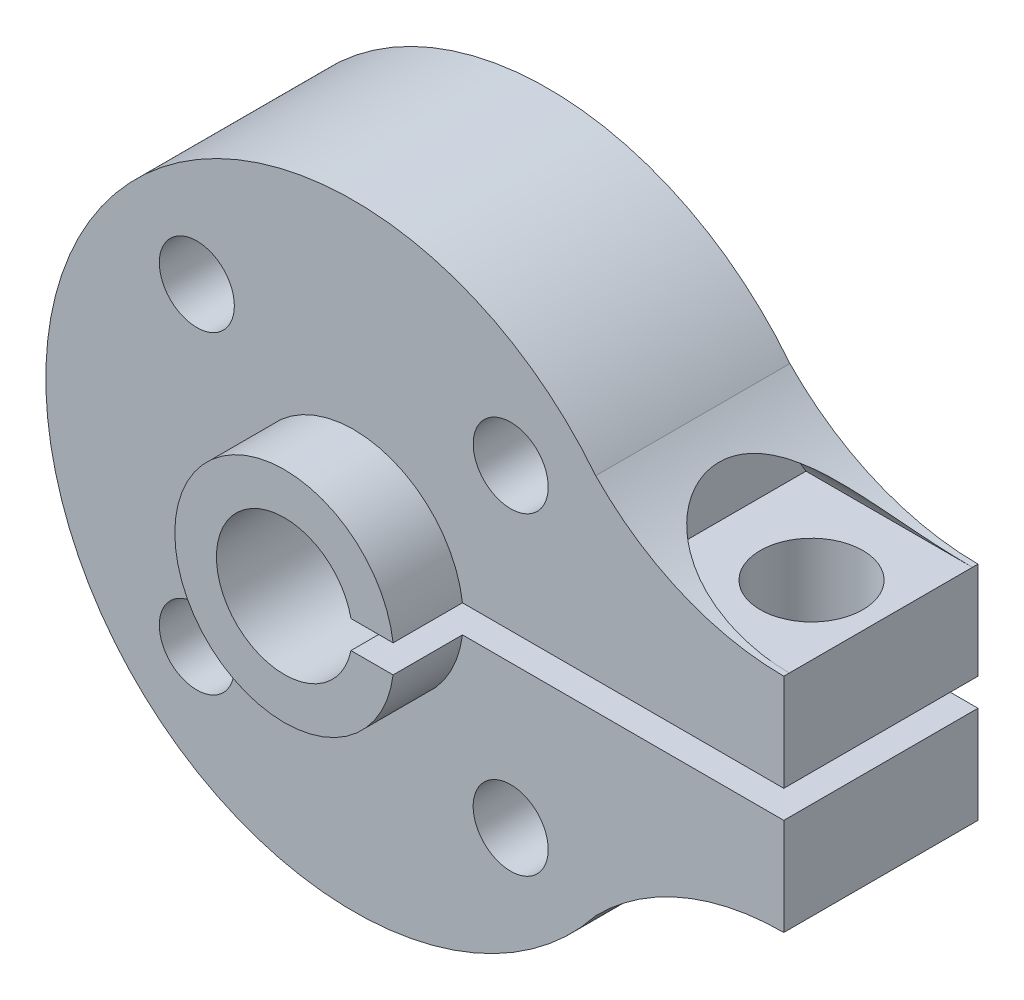
ISO-10303-21;
HEADER;
FILE_DESCRIPTION(('STEP AP214'),'2;1');
FILE_NAME('part.step','',(''),(''),'','','');
FILE_SCHEMA(('AUTOMOTIVE_DESIGN { 1 0 10303 214 1 1 1 1 }'));
ENDSEC;
DATA;
#1=APPLICATION_CONTEXT('core data for automotive mechanical design processes');
#2=APPLICATION_PROTOCOL_DEFINITION('international standard','automotive_design',2000,#1);
#3=PRODUCT_CONTEXT('',#1,'mechanical');
#4=PRODUCT('Part','Part','',(#3));
#5=PRODUCT_RELATED_PRODUCT_CATEGORY('part','',(#4));
#6=PRODUCT_DEFINITION_FORMATION('','',#4);
#7=PRODUCT_DEFINITION_CONTEXT('part definition',#1,'design');
#8=PRODUCT_DEFINITION('design','',#6,#7);
#9=PRODUCT_DEFINITION_SHAPE('','',#8);
#10=(LENGTH_UNIT() NAMED_UNIT(*) SI_UNIT(.MILLI.,.METRE.));
#11=(NAMED_UNIT(*) PLANE_ANGLE_UNIT() SI_UNIT($,.RADIAN.));
#12=(NAMED_UNIT(*) SI_UNIT($,.STERADIAN.) SOLID_ANGLE_UNIT());
#13=UNCERTAINTY_MEASURE_WITH_UNIT(LENGTH_MEASURE(1.E-05),#10,'distance_accuracy_value','');
#14=(GEOMETRIC_REPRESENTATION_CONTEXT(3) GLOBAL_UNCERTAINTY_ASSIGNED_CONTEXT((#13)) GLOBAL_UNIT_ASSIGNED_CONTEXT((#10,
#11,#12)) REPRESENTATION_CONTEXT('',''));
#15=CARTESIAN_POINT('',(0.,0.,0.));
#16=DIRECTION('',(0.,0.,1.));
#17=DIRECTION('',(1.,0.,0.));
#18=AXIS2_PLACEMENT_3D('',#15,#16,#17);
#19=CARTESIAN_POINT('',(0.,-0.5,-7.));
#20=DIRECTION('',(0.,1.,0.));
#21=DIRECTION('',(0.,0.,1.));
#22=AXIS2_PLACEMENT_3D('',#19,#20,#21);
#23=PLANE('',#22);
#24=CARTESIAN_POINT('',(13.,-0.499999999999999,-3.5));
#25=DIRECTION('',(0.,1.,0.));
#26=DIRECTION('',(0.,0.,1.));
#27=AXIS2_PLACEMENT_3D('',#24,#25,#26);
#28=CIRCLE('',#27,1.35254999999999);
#29=CARTESIAN_POINT('',(13.,-0.499999999999999,-2.14745000000001));
#30=VERTEX_POINT('',#29);
#31=EDGE_CURVE('E149',#30,#30,#28,.T.);
#32=ORIENTED_EDGE('',*,*,#31,.F.);
#33=EDGE_LOOP('',(#32));
#34=FACE_BOUND('',#33,.T.);
#35=DIRECTION('',(0.,0.,1.));
#36=VECTOR('',#35,1.);
#37=CARTESIAN_POINT('',(2.39843699104229,-0.5,-7.));
#38=LINE('',#37,#36);
#39=CARTESIAN_POINT('',(2.39843699104229,-0.5,2.5));
#40=VERTEX_POINT('',#39);
#41=CARTESIAN_POINT('',(2.39843699104229,-0.5,-7.));
#42=VERTEX_POINT('',#41);
#43=EDGE_CURVE('E238',#40,#42,#38,.F.);
#44=ORIENTED_EDGE('',*,*,#43,.F.);
#45=DIRECTION('',(-1.,0.,0.));
#46=VECTOR('',#45,1.);
#47=CARTESIAN_POINT('',(3.91822663969301,-0.5,2.5));
#48=LINE('',#47,#46);
#49=CARTESIAN_POINT('',(3.91822663969301,-0.5,2.5));
#50=VERTEX_POINT('',#49);
#51=EDGE_CURVE('E366',#50,#40,#48,.T.);
#52=ORIENTED_EDGE('',*,*,#51,.F.);
#53=DIRECTION('',(0.,0.,-1.));
#54=VECTOR('',#53,1.);
#55=CARTESIAN_POINT('',(3.91822663969301,-0.5,2.5));
#56=LINE('',#55,#54);
#57=CARTESIAN_POINT('',(3.91822663969301,-0.5,0.));
#58=VERTEX_POINT('',#57);
#59=EDGE_CURVE('E277',#50,#58,#56,.T.);
#60=ORIENTED_EDGE('',*,*,#59,.T.);
#61=DIRECTION('',(-1.,0.,0.));
#62=VECTOR('',#61,1.);
#63=CARTESIAN_POINT('',(0.,-0.5,0.));
#64=LINE('',#63,#62);
#65=CARTESIAN_POINT('',(15.5,-0.5,0.));
#66=VERTEX_POINT('',#65);
#67=EDGE_CURVE('E275',#66,#58,#64,.T.);
#68=ORIENTED_EDGE('',*,*,#67,.F.);
#69=DIRECTION('',(0.,0.,1.));
#70=VECTOR('',#69,1.);
#71=CARTESIAN_POINT('',(15.5,-0.5,-7.));
#72=LINE('',#71,#70);
#73=CARTESIAN_POINT('',(15.5,-0.5,-7.));
#74=VERTEX_POINT('',#73);
#75=EDGE_CURVE('E11',#74,#66,#72,.T.);
#76=ORIENTED_EDGE('',*,*,#75,.F.);
#77=DIRECTION('',(-1.,0.,0.));
#78=VECTOR('',#77,1.);
#79=CARTESIAN_POINT('',(0.,-0.5,-7.));
#80=LINE('',#79,#78);
#81=EDGE_CURVE('E250',#74,#42,#80,.T.);
#82=ORIENTED_EDGE('',*,*,#81,.T.);
#83=EDGE_LOOP('',(#44,#52,#60,#68,#76,#82));
#84=FACE_BOUND('',#83,.T.);
#85=ADVANCED_FACE('F33',(#34,#84),#23,.T.);
#86=CARTESIAN_POINT('',(15.5,-0.5,-7.));
#87=DIRECTION('',(1.,0.,0.));
#88=DIRECTION('',(0.,0.,-1.));
#89=AXIS2_PLACEMENT_3D('',#86,#87,#88);
#90=PLANE('',#89);
#91=DIRECTION('',(0.,1.,0.));
#92=VECTOR('',#91,1.);
#93=CARTESIAN_POINT('',(15.5,-0.5,0.));
#94=LINE('',#93,#92);
#95=CARTESIAN_POINT('',(15.5,-4.,0.));
#96=VERTEX_POINT('',#95);
#97=EDGE_CURVE('E344',#96,#66,#94,.T.);
#98=ORIENTED_EDGE('',*,*,#97,.F.);
#99=DIRECTION('',(0.,0.,1.));
#100=VECTOR('',#99,1.);
#101=CARTESIAN_POINT('',(15.5,-4.,-7.));
#102=LINE('',#101,#100);
#103=CARTESIAN_POINT('',(15.5,-4.,-7.));
#104=VERTEX_POINT('',#103);
#105=EDGE_CURVE('E42',#104,#96,#102,.T.);
#106=ORIENTED_EDGE('',*,*,#105,.F.);
#107=DIRECTION('',(0.,1.,0.));
#108=VECTOR('',#107,1.);
#109=CARTESIAN_POINT('',(15.5,-0.5,-7.));
#110=LINE('',#109,#108);
#111=EDGE_CURVE('E257',#104,#74,#110,.T.);
#112=ORIENTED_EDGE('',*,*,#111,.T.);
#113=ORIENTED_EDGE('',*,*,#75,.T.);
#114=EDGE_LOOP('',(#98,#106,#112,#113));
#115=FACE_BOUND('',#114,.T.);
#116=ADVANCED_FACE('F180',(#115),#90,.T.);
#117=CARTESIAN_POINT('',(15.5,-13.4475790200994,-7.));
#118=DIRECTION('',(0.,0.,1.));
#119=DIRECTION('',(1.,0.,0.));
#120=AXIS2_PLACEMENT_3D('',#117,#118,#119);
#121=CYLINDRICAL_SURFACE('',#120,9.44757902009939);
#122=CARTESIAN_POINT('',(13.,-4.33677503027379,-2.14745000000001));
#123=CARTESIAN_POINT('',(12.920428002283,-4.35861121109656,-2.14745335691339));
#124=CARTESIAN_POINT('',(12.8410856143969,-4.38151425754808,-2.15449314998647));
#125=CARTESIAN_POINT('',(12.6851670548864,-4.42870287612164,-2.18221386587579));
#126=CARTESIAN_POINT('',(12.6085951574822,-4.45299044703087,-2.20291499131835));
#127=CARTESIAN_POINT('',(12.4604293184877,-4.50197454214144,-2.25723253294131));
#128=CARTESIAN_POINT('',(12.3888294096472,-4.52667053047714,-2.2908331396974));
#129=CARTESIAN_POINT('',(12.252410648277,-4.57542230548958,-2.37007784325675));
#130=CARTESIAN_POINT('',(12.1875904871588,-4.59947821503988,-2.41571960993089));
#131=CARTESIAN_POINT('',(12.066091364472,-4.6459152635556,-2.51838125477293));
#132=CARTESIAN_POINT('',(12.0094736500041,-4.66828325960249,-2.57547982627147));
#133=CARTESIAN_POINT('',(11.906792558052,-4.70980559286506,-2.69952176892456));
#134=CARTESIAN_POINT('',(11.8607269572762,-4.72896060681611,-2.76646306136473));
#135=CARTESIAN_POINT('',(11.7828596438642,-4.76188237467915,-2.90504273156142));
#136=CARTESIAN_POINT('',(11.7504845747047,-4.77586176486633,-2.97630723273934));
#137=CARTESIAN_POINT('',(11.6983802163458,-4.79857589645762,-3.12409554076796));
#138=CARTESIAN_POINT('',(11.6786423287398,-4.80731420366648,-3.2006157322827));
#139=CARTESIAN_POINT('',(11.6538330510493,-4.81833124771182,-3.35003068004965));
#140=CARTESIAN_POINT('',(11.6477021570998,-4.82107632535583,-3.42271626846628));
#141=CARTESIAN_POINT('',(11.6472133447393,-4.82129439548716,-3.56812567795028));
#142=CARTESIAN_POINT('',(11.6528522723431,-4.8187688003684,-3.64084948355552));
#143=CARTESIAN_POINT('',(11.6751489538583,-4.80886385163248,-3.78104815293384));
#144=CARTESIAN_POINT('',(11.6913300386454,-4.80169454397175,-3.84861488487293));
#145=CARTESIAN_POINT('',(11.7335933027133,-4.78320032700628,-3.97996595763252));
#146=CARTESIAN_POINT('',(11.7596766697632,-4.77187491918679,-4.04374984364268));
#147=CARTESIAN_POINT('',(11.8218428560634,-4.74533313647277,-4.1680766014053));
#148=CARTESIAN_POINT('',(11.8582264286167,-4.73000100589236,-4.22844379968047));
#149=CARTESIAN_POINT('',(11.939439455476,-4.69651711454953,-4.34231730710186));
#150=CARTESIAN_POINT('',(11.9842716212432,-4.67836444890381,-4.39582140433819));
#151=CARTESIAN_POINT('',(12.0848983892028,-4.63866491300953,-4.49877337114578));
#152=CARTESIAN_POINT('',(12.1412686121449,-4.61696471602338,-4.54759971484536));
#153=CARTESIAN_POINT('',(12.2609318042408,-4.57237399778968,-4.63519723021203));
#154=CARTESIAN_POINT('',(12.3242271511778,-4.54948306912127,-4.67396493268254));
#155=CARTESIAN_POINT('',(12.4603320261254,-4.50203996061197,-4.7427043180684));
#156=CARTESIAN_POINT('',(12.5334880857444,-4.47747274748031,-4.77198195357976));
#157=CARTESIAN_POINT('',(12.6840024707886,-4.42908940810125,-4.81746682583201));
#158=CARTESIAN_POINT('',(12.7613612276864,-4.40527335937088,-4.83367271783678));
#159=CARTESIAN_POINT('',(12.91897692536,-4.35902160855735,-4.85247375454001));
#160=CARTESIAN_POINT('',(12.9992549026301,-4.33660180675001,-4.85493331249421));
#161=CARTESIAN_POINT('',(13.1595924171864,-4.29410337844887,-4.84549879009424));
#162=CARTESIAN_POINT('',(13.2396519927503,-4.27402431200944,-4.83360741181079));
#163=CARTESIAN_POINT('',(13.3944384999497,-4.23728652695497,-4.79612680662636));
#164=CARTESIAN_POINT('',(13.4692541493842,-4.22053829577808,-4.7709923147757));
#165=CARTESIAN_POINT('',(13.6138488545252,-4.18989861348698,-4.70780858379045));
#166=CARTESIAN_POINT('',(13.68362900024,-4.17600654290398,-4.66976214986444));
#167=CARTESIAN_POINT('',(13.8133418687804,-4.15155096206038,-4.58338069724963));
#168=CARTESIAN_POINT('',(13.8735433653714,-4.14088333878366,-4.53547829669449));
#169=CARTESIAN_POINT('',(13.9851526167812,-4.12206585659273,-4.42992630704227));
#170=CARTESIAN_POINT('',(14.0365613534343,-4.11391571648435,-4.37227780766455));
#171=CARTESIAN_POINT('',(14.1280258528812,-4.10003700463368,-4.25010637340326));
#172=CARTESIAN_POINT('',(14.1682834389617,-4.09426431399409,-4.18573939960065));
#173=CARTESIAN_POINT('',(14.2375170268922,-4.08466744662228,-4.05106702362797));
#174=CARTESIAN_POINT('',(14.2664934018518,-4.08084320544666,-3.98076181794981));
#175=CARTESIAN_POINT('',(14.3121708919116,-4.0749410262174,-3.83658547870783));
#176=CARTESIAN_POINT('',(14.3289317690251,-4.07285457906941,-3.76273361590262));
#177=CARTESIAN_POINT('',(14.349912808162,-4.07025730942951,-3.61324210309492));
#178=CARTESIAN_POINT('',(14.3541329770235,-4.06974648607849,-3.53760245406725));
#179=CARTESIAN_POINT('',(14.3499074339153,-4.07026380931247,-3.38669109931068));
#180=CARTESIAN_POINT('',(14.3414630463761,-4.07129179497232,-3.31141935593291));
#181=CARTESIAN_POINT('',(14.3121613558508,-4.07495910572938,-3.16337255015843));
#182=CARTESIAN_POINT('',(14.2913040843862,-4.07759842673476,-3.09059748142213));
#183=CARTESIAN_POINT('',(14.2377999411704,-4.08465619600932,-2.9496114799044));
#184=CARTESIAN_POINT('',(14.2051532185456,-4.08907462177445,-2.88140048940423));
#185=CARTESIAN_POINT('',(14.129058407923,-4.0999194684645,-2.75147768248332));
#186=CARTESIAN_POINT('',(14.0856109126004,-4.10634577921492,-2.68976550971477));
#187=CARTESIAN_POINT('',(13.9892356150547,-4.12144837302153,-2.57455655449143));
#188=CARTESIAN_POINT('',(13.9363065969803,-4.13012494470114,-2.52106082729846));
#189=CARTESIAN_POINT('',(13.8225858012945,-4.14992582003807,-2.4237351581676));
#190=CARTESIAN_POINT('',(13.7617924016259,-4.16105062898604,-2.37990721530408));
#191=CARTESIAN_POINT('',(13.6338306635307,-4.18591438897955,-2.30280935437042));
#192=CARTESIAN_POINT('',(13.5666263306613,-4.1996685951101,-2.26960423146465));
#193=CARTESIAN_POINT('',(13.4282106038498,-4.22969224550081,-2.2148708737775));
#194=CARTESIAN_POINT('',(13.3570030547708,-4.24595930169971,-2.19333163911603));
#195=CARTESIAN_POINT('',(13.2378427204527,-4.27469817565466,-2.16765678807984));
#196=CARTESIAN_POINT('',(13.1904436366513,-4.28651419880773,-2.16007112655979));
#197=CARTESIAN_POINT('',(13.0953356146364,-4.3110177632203,-2.14996674925063));
#198=CARTESIAN_POINT('',(13.0476266790371,-4.32370529713549,-2.14744799076761));
#199=CARTESIAN_POINT('',(13.,-4.33677503027379,-2.14745000000001));
#200=B_SPLINE_CURVE_WITH_KNOTS('',3,(#122,#123,#124,#125,#126,#127,#128,#129,#130,#131,#132,
#133,#134,#135,#136,#137,#138,#139,#140,#141,#142,#143,#144,#145,#146,#147,#148,#149,#150,#151,
#152,#153,#154,#155,#156,#157,#158,#159,#160,#161,#162,#163,#164,#165,#166,#167,#168,#169,#170,
#171,#172,#173,#174,#175,#176,#177,#178,#179,#180,#181,#182,#183,#184,#185,#186,#187,#188,#189,
#190,#191,#192,#193,#194,#195,#196,#197,#198,#199),.UNSPECIFIED.,.T.,.F.,(4,2,2,2,2,2,2,2,2,2,2,
2,2,2,2,2,2,2,2,2,2,2,2,2,2,2,2,2,2,2,2,2,2,2,2,2,2,2,4),(0.,0.247356825808423,
0.495080269550967,0.742501071164717,0.98987402854504,1.23900816514051,1.48808976170784,
1.72534609441818,1.9624408246001,2.18030983675598,2.39812047356379,2.60670856750485,
2.81532168929471,3.03079828914877,3.24634416142958,3.47834590769095,3.71042756464356,
3.95689267338338,4.2033831336213,4.45230061443386,4.70117123504827,4.94200525484895,
5.18278698525588,5.4146624573444,5.64651202037108,5.87384080291791,6.10116206625961,
6.32736359797962,6.55356500636084,6.77974276076549,7.00591994081568,7.23209426001963,
7.45825617100813,7.68444710437902,7.91068476505537,8.13827718197472,8.36565462451313,
8.51370775570251,8.66175963938539),.UNSPECIFIED.);
#201=CARTESIAN_POINT('',(13.,-4.33677503027379,-2.14745000000001));
#202=VERTEX_POINT('',#201);
#203=EDGE_CURVE('E166',#202,#202,#200,.T.);
#204=ORIENTED_EDGE('',*,*,#203,.F.);
#205=EDGE_LOOP('',(#204));
#206=FACE_BOUND('',#205,.T.);
#207=CARTESIAN_POINT('',(15.5,-13.4475790200994,0.));
#208=DIRECTION('',(0.,0.,-1.));
#209=DIRECTION('',(1.,0.,0.));
#210=AXIS2_PLACEMENT_3D('',#207,#208,#209);
#211=CIRCLE('',#210,9.44757902009939);
#212=CARTESIAN_POINT('',(8.71986454121639,-6.86833039266728,0.));
#213=VERTEX_POINT('',#212);
#214=EDGE_CURVE('E347',#213,#96,#211,.T.);
#215=ORIENTED_EDGE('',*,*,#214,.F.);
#216=DIRECTION('',(0.,0.,1.));
#217=VECTOR('',#216,1.);
#218=CARTESIAN_POINT('',(8.71986454121639,-6.86833039266728,-7.));
#219=LINE('',#218,#217);
#220=CARTESIAN_POINT('',(8.71986454121639,-6.86833039266728,-7.));
#221=VERTEX_POINT('',#220);
#222=EDGE_CURVE('E328',#221,#213,#219,.T.);
#223=ORIENTED_EDGE('',*,*,#222,.F.);
#224=CARTESIAN_POINT('',(15.5,-13.4475790200994,-7.));
#225=DIRECTION('',(0.,0.,-1.));
#226=DIRECTION('',(1.,0.,0.));
#227=AXIS2_PLACEMENT_3D('',#224,#225,#226);
#228=CIRCLE('',#227,9.44757902009939);
#229=EDGE_CURVE('E262',#221,#104,#228,.T.);
#230=ORIENTED_EDGE('',*,*,#229,.T.);
#231=ORIENTED_EDGE('',*,*,#105,.T.);
#232=EDGE_LOOP('',(#215,#223,#230,#231));
#233=FACE_BOUND('',#232,.T.);
#234=ADVANCED_FACE('F175',(#206,#233),#121,.F.);
#235=CARTESIAN_POINT('',(0.,0.,-7.));
#236=DIRECTION('',(0.,0.,1.));
#237=DIRECTION('',(1.,0.,0.));
#238=AXIS2_PLACEMENT_3D('',#235,#236,#237);
#239=CYLINDRICAL_SURFACE('',#238,11.1);
#240=CARTESIAN_POINT('',(0.,0.,0.));
#241=DIRECTION('',(0.,0.,1.));
#242=DIRECTION('',(1.,0.,0.));
#243=AXIS2_PLACEMENT_3D('',#240,#241,#242);
#244=CIRCLE('',#243,11.1);
#245=CARTESIAN_POINT('',(8.71986454121639,6.86833039266728,0.));
#246=VERTEX_POINT('',#245);
#247=EDGE_CURVE('E333',#246,#213,#244,.T.);
#248=ORIENTED_EDGE('',*,*,#247,.F.);
#249=DIRECTION('',(0.,0.,1.));
#250=VECTOR('',#249,1.);
#251=CARTESIAN_POINT('',(8.71986454121639,6.86833039266728,-7.));
#252=LINE('',#251,#250);
#253=CARTESIAN_POINT('',(8.71986454121639,6.86833039266728,-7.));
#254=VERTEX_POINT('',#253);
#255=EDGE_CURVE('E331',#254,#246,#252,.T.);
#256=ORIENTED_EDGE('',*,*,#255,.F.);
#257=CARTESIAN_POINT('',(0.,0.,-7.));
#258=DIRECTION('',(0.,0.,1.));
#259=DIRECTION('',(1.,0.,0.));
#260=AXIS2_PLACEMENT_3D('',#257,#258,#259);
#261=CIRCLE('',#260,11.1);
#262=EDGE_CURVE('E321',#254,#221,#261,.T.);
#263=ORIENTED_EDGE('',*,*,#262,.T.);
#264=ORIENTED_EDGE('',*,*,#222,.T.);
#265=EDGE_LOOP('',(#248,#256,#263,#264));
#266=FACE_BOUND('',#265,.T.);
#267=ADVANCED_FACE('F179',(#266),#239,.T.);
#268=CARTESIAN_POINT('',(15.5,13.4475790200994,-7.));
#269=DIRECTION('',(0.,0.,1.));
#270=DIRECTION('',(1.,0.,0.));
#271=AXIS2_PLACEMENT_3D('',#268,#269,#270);
#272=CYLINDRICAL_SURFACE('',#271,9.44757902009939);
#273=CARTESIAN_POINT('',(15.5,4.,-6.8));
#274=CARTESIAN_POINT('',(15.3854172561424,3.99999807144267,-6.79999040357477));
#275=CARTESIAN_POINT('',(15.2708345037204,4.00208452565123,-6.79893104370746));
#276=CARTESIAN_POINT('',(15.0418545088414,4.01042007363528,-6.79464326988381));
#277=CARTESIAN_POINT('',(14.927457277829,4.01666941510604,-6.79141472685915));
#278=CARTESIAN_POINT('',(14.6988557808845,4.03333058412202,-6.78271174393225));
#279=CARTESIAN_POINT('',(14.5846521614541,4.04374938302887,-6.7772335421817));
#280=CARTESIAN_POINT('',(14.3568466591295,4.06871528645661,-6.76388854983141));
#281=CARTESIAN_POINT('',(14.2432447653972,4.08326231636212,-6.75602180240309));
#282=CARTESIAN_POINT('',(13.9012476272513,4.13338726905937,-6.72837211210196));
#283=CARTESIAN_POINT('',(13.6740472792935,4.17527511633216,-6.70462249151998));
#284=CARTESIAN_POINT('',(13.2250868669362,4.2751032631053,-6.6443418692978));
#285=CARTESIAN_POINT('',(13.0033221022707,4.33302911979295,-6.60782235966463));
#286=CARTESIAN_POINT('',(12.6529356022981,4.43813091397701,-6.53609331014185));
#287=CARTESIAN_POINT('',(12.5218503492442,4.48063203510912,-6.50597227338733));
#288=CARTESIAN_POINT('',(12.2632290057728,4.57071030493075,-6.43877426680966));
#289=CARTESIAN_POINT('',(12.1356928962284,4.61828742625827,-6.40169733448122));
#290=CARTESIAN_POINT('',(11.8854487831583,4.71775519771825,-6.31963922664294));
#291=CARTESIAN_POINT('',(11.7627254940675,4.76963022726073,-6.27468606548902));
#292=CARTESIAN_POINT('',(11.5227135874723,4.87697578128223,-6.1756110759212));
#293=CARTESIAN_POINT('',(11.4054232772453,4.93244517278819,-6.12149212804412));
#294=CARTESIAN_POINT('',(11.1256985684173,5.071639846092,-5.97585734382104));
#295=CARTESIAN_POINT('',(10.9669053561282,5.15677415238714,-5.87851068639103));
#296=CARTESIAN_POINT('',(10.6682954041506,5.32718244619845,-5.65805983866077));
#297=CARTESIAN_POINT('',(10.5284532138078,5.41245608755683,-5.53499076935316));
#298=CARTESIAN_POINT('',(10.3029570714845,5.55700216381973,-5.29236628463612));
#299=CARTESIAN_POINT('',(10.2122236670459,5.61776209979494,-5.17843958840173));
#300=CARTESIAN_POINT('',(10.0487893069114,5.73065496290752,-4.93421505548655));
#301=CARTESIAN_POINT('',(9.9760826861075,5.78279059860416,-4.80392238142989));
#302=CARTESIAN_POINT('',(9.88271984953562,5.85123562170811,-4.59746178007879));
#303=CARTESIAN_POINT('',(9.85411340712691,5.87250463892867,-4.52642625450106));
#304=CARTESIAN_POINT('',(9.80265428832829,5.91113202664649,-4.38128999145579));
#305=CARTESIAN_POINT('',(9.77979860146107,5.92849244276424,-4.30719088150623));
#306=CARTESIAN_POINT('',(9.74015073098037,5.95881984828703,-4.15653545136116));
#307=CARTESIAN_POINT('',(9.72335620443466,5.97178853518842,-4.07998009311206));
#308=CARTESIAN_POINT('',(9.69604787686337,5.99297113329585,-3.92514115874213));
#309=CARTESIAN_POINT('',(9.68553304823361,6.00118582243503,-3.84685786755397));
#310=CARTESIAN_POINT('',(9.66571269419053,6.01668686364119,-3.63272797682053));
#311=CARTESIAN_POINT('',(9.66268060711464,6.01908388455584,-3.49585578487429));
#312=CARTESIAN_POINT('',(9.67580092483512,6.00879517138107,-3.2237243583321));
#313=CARTESIAN_POINT('',(9.69194697787807,5.99611443100812,-3.08846460468292));
#314=CARTESIAN_POINT('',(9.74140060570357,5.95784036040202,-2.83033541035475));
#315=CARTESIAN_POINT('',(9.77379479620415,5.93293564756355,-2.70718559216986));
#316=CARTESIAN_POINT('',(9.85403038461301,5.87246966733322,-2.46884489684084));
#317=CARTESIAN_POINT('',(9.90187372262156,5.83690706156605,-2.3536550215112));
#318=CARTESIAN_POINT('',(10.0153708669368,5.75467131035558,-2.12530832541396));
#319=CARTESIAN_POINT('',(10.0820564209863,5.70738398145103,-2.01289063057051));
#320=CARTESIAN_POINT('',(10.2292221810183,5.6064316192375,-1.80068540326612));
#321=CARTESIAN_POINT('',(10.3097094543092,5.55276332282889,-1.70090438727909));
#322=CARTESIAN_POINT('',(10.4617575283369,5.45514545743435,-1.53638994983406));
#323=CARTESIAN_POINT('',(10.5309064551307,5.41191057285586,-1.46895760039825));
#324=CARTESIAN_POINT('',(10.6750840937525,5.32452300554102,-1.34130785397804));
#325=CARTESIAN_POINT('',(10.7501152592551,5.28036994550684,-1.28109349462555));
#326=CARTESIAN_POINT('',(10.9053325302043,5.19204954805674,-1.16745307872577));
#327=CARTESIAN_POINT('',(10.9855265073713,5.14788229613572,-1.11403777634628));
#328=CARTESIAN_POINT('',(11.1502648300482,5.0603706338556,-1.01360351201137));
#329=CARTESIAN_POINT('',(11.2348105538086,5.01702649020898,-0.966586593895368));
#330=CARTESIAN_POINT('',(11.4491601443267,4.91131764268599,-0.857234031716228));
#331=CARTESIAN_POINT('',(11.5811855099708,4.84982407399194,-0.798397249946975));
#332=CARTESIAN_POINT('',(11.8517008005558,4.73158833415568,-0.691850969184465));
#333=CARTESIAN_POINT('',(11.9901938582407,4.67484850353949,-0.644146931053224));
#334=CARTESIAN_POINT('',(12.2727994055429,4.56698866176261,-0.558090419684879));
#335=CARTESIAN_POINT('',(12.4169310013095,4.51589049754442,-0.51977364504478));
#336=CARTESIAN_POINT('',(12.7092115298442,4.42029218777549,-0.451279086548749));
#337=CARTESIAN_POINT('',(12.8573601583134,4.37579154409096,-0.421100688078473));
#338=CARTESIAN_POINT('',(13.2088503671494,4.27964035910125,-0.358348077632845));
#339=CARTESIAN_POINT('',(13.4134887431049,4.23087541572759,-0.328582781999698));
#340=CARTESIAN_POINT('',(13.8267983828837,4.14695137700668,-0.27920251319416));
#341=CARTESIAN_POINT('',(14.0354716910433,4.11179937907042,-0.259592833084838));
#342=CARTESIAN_POINT('',(14.4530137871775,4.05585754801037,-0.229084764078337));
#343=CARTESIAN_POINT('',(14.6618549020662,4.0349132104665,-0.218092452133775));
#344=CARTESIAN_POINT('',(14.9758505914231,4.01396785329269,-0.207190475715985));
#345=CARTESIAN_POINT('',(15.0805924216449,4.00873126349008,-0.204487528312589));
#346=CARTESIAN_POINT('',(15.2902194458754,4.00174728093228,-0.200895003143423));
#347=CARTESIAN_POINT('',(15.3951046341522,3.99999975253346,-0.200005354882308));
#348=CARTESIAN_POINT('',(15.5,4.,-0.200000000000001));
#349=B_SPLINE_CURVE_WITH_KNOTS('',3,(#273,#274,#275,#276,#277,#278,#279,#280,#281,#282,#283,
#284,#285,#286,#287,#288,#289,#290,#291,#292,#293,#294,#295,#296,#297,#298,#299,#300,#301,#302,
#303,#304,#305,#306,#307,#308,#309,#310,#311,#312,#313,#314,#315,#316,#317,#318,#319,#320,#321,
#322,#323,#324,#325,#326,#327,#328,#329,#330,#331,#332,#333,#334,#335,#336,#337,#338,#339,#340,
#341,#342,#343,#344,#345,#346,#347,#348),.UNSPECIFIED.,.F.,.F.,(4,2,2,2,2,2,2,2,2,2,2,2,2,2,2,2,
2,2,2,2,2,2,2,2,2,2,2,2,2,2,2,2,2,2,2,2,2,4),(0.,0.343723971843538,0.687468397378404,
1.03178998346891,1.37610534654197,2.07189509147166,2.76706027899653,3.18996821448662,
3.61287387042043,4.03430477997363,4.45560349113384,5.06790502421624,5.67937592856169,
6.15105760704357,6.62259086613705,6.86072027072559,7.09872475577784,7.33663714177353,
7.57451058532365,7.98295112010661,8.39125641808701,8.77882172170533,9.16643571462257,
9.58186622266927,9.99751009479543,10.3145531519377,10.6317291690793,10.9494007936139,
11.2671736551728,11.7376814003852,12.2084194574227,12.6809208132693,13.1533864755719,
13.7899635271709,14.4268720269306,15.0567382504914,15.3713976456646,15.6860448076409),.UNSPECIFIED.);
#350=CARTESIAN_POINT('',(15.5,4.,-6.8));
#351=VERTEX_POINT('',#350);
#352=CARTESIAN_POINT('',(15.5,4.,-0.2));
#353=VERTEX_POINT('',#352);
#354=EDGE_CURVE('E128',#351,#353,#349,.T.);
#355=ORIENTED_EDGE('',*,*,#354,.F.);
#356=DIRECTION('',(0.,0.,1.));
#357=VECTOR('',#356,1.);
#358=CARTESIAN_POINT('',(15.5,4.,-7.));
#359=LINE('',#358,#357);
#360=CARTESIAN_POINT('',(15.5,4.,-7.));
#361=VERTEX_POINT('',#360);
#362=EDGE_CURVE('E336',#361,#351,#359,.T.);
#363=ORIENTED_EDGE('',*,*,#362,.F.);
#364=CARTESIAN_POINT('',(15.5,13.4475790200994,-7.));
#365=DIRECTION('',(0.,0.,-1.));
#366=DIRECTION('',(-1.,0.,0.));
#367=AXIS2_PLACEMENT_3D('',#364,#365,#366);
#368=CIRCLE('',#367,9.44757902009939);
#369=EDGE_CURVE('E318',#361,#254,#368,.T.);
#370=ORIENTED_EDGE('',*,*,#369,.T.);
#371=ORIENTED_EDGE('',*,*,#255,.T.);
#372=CARTESIAN_POINT('',(15.5,13.4475790200994,0.));
#373=DIRECTION('',(0.,0.,-1.));
#374=DIRECTION('',(-1.,0.,0.));
#375=AXIS2_PLACEMENT_3D('',#372,#373,#374);
#376=CIRCLE('',#375,9.44757902009939);
#377=CARTESIAN_POINT('',(15.5,4.,0.));
#378=VERTEX_POINT('',#377);
#379=EDGE_CURVE('E350',#378,#246,#376,.T.);
#380=ORIENTED_EDGE('',*,*,#379,.F.);
#381=EDGE_CURVE('E260',#353,#378,#359,.T.);
#382=ORIENTED_EDGE('',*,*,#381,.F.);
#383=EDGE_LOOP('',(#355,#363,#370,#371,#380,#382));
#384=FACE_BOUND('',#383,.T.);
#385=ADVANCED_FACE('F151',(#384),#272,.F.);
#386=CARTESIAN_POINT('',(15.5,0.5,-7.));
#387=DIRECTION('',(1.,0.,0.));
#388=DIRECTION('',(0.,0.,-1.));
#389=AXIS2_PLACEMENT_3D('',#386,#387,#388);
#390=PLANE('',#389);
#391=DIRECTION('',(0.,1.,0.));
#392=VECTOR('',#391,1.);
#393=CARTESIAN_POINT('',(15.5,0.5,0.));
#394=LINE('',#393,#392);
#395=CARTESIAN_POINT('',(15.5,0.5,0.));
#396=VERTEX_POINT('',#395);
#397=EDGE_CURVE('E268',#396,#378,#394,.T.);
#398=ORIENTED_EDGE('',*,*,#397,.F.);
#399=DIRECTION('',(0.,0.,1.));
#400=VECTOR('',#399,1.);
#401=CARTESIAN_POINT('',(15.5,0.5,-7.));
#402=LINE('',#401,#400);
#403=CARTESIAN_POINT('',(15.5,0.5,-7.));
#404=VERTEX_POINT('',#403);
#405=EDGE_CURVE('E256',#404,#396,#402,.T.);
#406=ORIENTED_EDGE('',*,*,#405,.F.);
#407=DIRECTION('',(0.,1.,0.));
#408=VECTOR('',#407,1.);
#409=CARTESIAN_POINT('',(15.5,0.5,-7.));
#410=LINE('',#409,#408);
#411=EDGE_CURVE('E315',#404,#361,#410,.T.);
#412=ORIENTED_EDGE('',*,*,#411,.T.);
#413=ORIENTED_EDGE('',*,*,#362,.T.);
#414=DIRECTION('',(0.,0.,-1.));
#415=VECTOR('',#414,1.);
#416=CARTESIAN_POINT('',(15.5,4.,-0.2));
#417=LINE('',#416,#415);
#418=EDGE_CURVE('E135',#353,#351,#417,.T.);
#419=ORIENTED_EDGE('',*,*,#418,.F.);
#420=ORIENTED_EDGE('',*,*,#381,.T.);
#421=EDGE_LOOP('',(#398,#406,#412,#413,#419,#420));
#422=FACE_BOUND('',#421,.T.);
#423=ADVANCED_FACE('F188',(#422),#390,.T.);
#424=CARTESIAN_POINT('',(0.,0.5,-7.));
#425=DIRECTION('',(0.,-1.,0.));
#426=DIRECTION('',(0.,0.,-1.));
#427=AXIS2_PLACEMENT_3D('',#424,#425,#426);
#428=PLANE('',#427);
#429=CARTESIAN_POINT('',(13.,0.5,-3.5));
#430=DIRECTION('',(0.,-1.,0.));
#431=DIRECTION('',(0.,0.,-1.));
#432=AXIS2_PLACEMENT_3D('',#429,#430,#431);
#433=CIRCLE('',#432,1.85);
#434=CARTESIAN_POINT('',(13.,0.5,-5.35));
#435=VERTEX_POINT('',#434);
#436=EDGE_CURVE('E172',#435,#435,#433,.T.);
#437=ORIENTED_EDGE('',*,*,#436,.F.);
#438=EDGE_LOOP('',(#437));
#439=FACE_BOUND('',#438,.T.);
#440=DIRECTION('',(0.,0.,1.));
#441=VECTOR('',#440,1.);
#442=CARTESIAN_POINT('',(2.39843699104229,0.5,-7.));
#443=LINE('',#442,#441);
#444=CARTESIAN_POINT('',(2.39843699104229,0.5,-7.));
#445=VERTEX_POINT('',#444);
#446=CARTESIAN_POINT('',(2.39843699104229,0.5,2.5));
#447=VERTEX_POINT('',#446);
#448=EDGE_CURVE('E58',#445,#447,#443,.T.);
#449=ORIENTED_EDGE('',*,*,#448,.F.);
#450=DIRECTION('',(1.,0.,0.));
#451=VECTOR('',#450,1.);
#452=CARTESIAN_POINT('',(0.,0.5,-7.));
#453=LINE('',#452,#451);
#454=EDGE_CURVE('E252',#445,#404,#453,.T.);
#455=ORIENTED_EDGE('',*,*,#454,.T.);
#456=ORIENTED_EDGE('',*,*,#405,.T.);
#457=DIRECTION('',(1.,0.,0.));
#458=VECTOR('',#457,1.);
#459=CARTESIAN_POINT('',(0.,0.5,0.));
#460=LINE('',#459,#458);
#461=CARTESIAN_POINT('',(3.91822663969301,0.5,0.));
#462=VERTEX_POINT('',#461);
#463=EDGE_CURVE('E271',#462,#396,#460,.T.);
#464=ORIENTED_EDGE('',*,*,#463,.F.);
#465=DIRECTION('',(0.,0.,-1.));
#466=VECTOR('',#465,1.);
#467=CARTESIAN_POINT('',(3.91822663969301,0.5,2.5));
#468=LINE('',#467,#466);
#469=CARTESIAN_POINT('',(3.91822663969301,0.5,2.5));
#470=VERTEX_POINT('',#469);
#471=EDGE_CURVE('E281',#470,#462,#468,.T.);
#472=ORIENTED_EDGE('',*,*,#471,.F.);
#473=DIRECTION('',(1.,0.,0.));
#474=VECTOR('',#473,1.);
#475=CARTESIAN_POINT('',(0.,0.5,2.5));
#476=LINE('',#475,#474);
#477=EDGE_CURVE('E290',#447,#470,#476,.T.);
#478=ORIENTED_EDGE('',*,*,#477,.F.);
#479=EDGE_LOOP('',(#449,#455,#456,#464,#472,#478));
#480=FACE_BOUND('',#479,.T.);
#481=ADVANCED_FACE('F35',(#439,#480),#428,.T.);
#482=CARTESIAN_POINT('',(15.5,-13.4475790200994,-7.));
#483=DIRECTION('',(0.,0.,1.));
#484=DIRECTION('',(1.,0.,0.));
#485=AXIS2_PLACEMENT_3D('',#482,#483,#484);
#486=PLANE('',#485);
#487=CARTESIAN_POINT('',(-5.65651622481619,5.65719225397115,-7.));
#488=DIRECTION('',(0.,0.,1.));
#489=DIRECTION('',(1.,0.,0.));
#490=AXIS2_PLACEMENT_3D('',#487,#488,#489);
#491=CIRCLE('',#490,1.35254999999999);
#492=CARTESIAN_POINT('',(-4.3039662248162,5.65719225397115,-7.));
#493=VERTEX_POINT('',#492);
#494=EDGE_CURVE('E280',#493,#493,#491,.T.);
#495=ORIENTED_EDGE('',*,*,#494,.T.);
#496=EDGE_LOOP('',(#495));
#497=FACE_BOUND('',#496,.T.);
#498=CARTESIAN_POINT('',(5.65719225397115,5.65651622481619,-7.));
#499=DIRECTION('',(0.,0.,1.));
#500=DIRECTION('',(1.,0.,0.));
#501=AXIS2_PLACEMENT_3D('',#498,#499,#500);
#502=CIRCLE('',#501,1.35254999999999);
#503=CARTESIAN_POINT('',(7.00974225397114,5.65651622481619,-7.));
#504=VERTEX_POINT('',#503);
#505=EDGE_CURVE('E297',#504,#504,#502,.T.);
#506=ORIENTED_EDGE('',*,*,#505,.T.);
#507=EDGE_LOOP('',(#506));
#508=FACE_BOUND('',#507,.T.);
#509=CARTESIAN_POINT('',(5.65651622481619,-5.65719225397115,-7.));
#510=DIRECTION('',(0.,0.,1.));
#511=DIRECTION('',(1.,0.,0.));
#512=AXIS2_PLACEMENT_3D('',#509,#510,#511);
#513=CIRCLE('',#512,1.35254999999999);
#514=CARTESIAN_POINT('',(7.00906622481619,-5.65719225397115,-7.));
#515=VERTEX_POINT('',#514);
#516=EDGE_CURVE('E303',#515,#515,#513,.T.);
#517=ORIENTED_EDGE('',*,*,#516,.T.);
#518=EDGE_LOOP('',(#517));
#519=FACE_BOUND('',#518,.T.);
#520=CARTESIAN_POINT('',(-5.65719225397115,-5.65651622481619,-7.));
#521=DIRECTION('',(0.,0.,1.));
#522=DIRECTION('',(1.,0.,0.));
#523=AXIS2_PLACEMENT_3D('',#520,#521,#522);
#524=CIRCLE('',#523,1.35254999999999);
#525=CARTESIAN_POINT('',(-4.30464225397115,-5.65651622481619,-7.));
#526=VERTEX_POINT('',#525);
#527=EDGE_CURVE('E309',#526,#526,#524,.T.);
#528=ORIENTED_EDGE('',*,*,#527,.T.);
#529=EDGE_LOOP('',(#528));
#530=FACE_BOUND('',#529,.T.);
#531=ORIENTED_EDGE('',*,*,#454,.F.);
#532=CARTESIAN_POINT('',(0.,0.,-7.));
#533=DIRECTION('',(0.,0.,1.));
#534=DIRECTION('',(1.,0.,0.));
#535=AXIS2_PLACEMENT_3D('',#532,#533,#534);
#536=CIRCLE('',#535,2.45);
#537=EDGE_CURVE('E240',#445,#42,#536,.T.);
#538=ORIENTED_EDGE('',*,*,#537,.T.);
#539=ORIENTED_EDGE('',*,*,#81,.F.);
#540=ORIENTED_EDGE('',*,*,#111,.F.);
#541=ORIENTED_EDGE('',*,*,#229,.F.);
#542=ORIENTED_EDGE('',*,*,#262,.F.);
#543=ORIENTED_EDGE('',*,*,#369,.F.);
#544=ORIENTED_EDGE('',*,*,#411,.F.);
#545=EDGE_LOOP('',(#531,#538,#539,#540,#541,#542,#543,#544));
#546=FACE_BOUND('',#545,.T.);
#547=ADVANCED_FACE('F204',(#497,#508,#519,#530,#546),#486,.F.);
#548=CARTESIAN_POINT('',(15.5,-13.4475790200994,0.));
#549=DIRECTION('',(0.,0.,1.));
#550=DIRECTION('',(1.,0.,0.));
#551=AXIS2_PLACEMENT_3D('',#548,#549,#550);
#552=PLANE('',#551);
#553=CARTESIAN_POINT('',(0.,0.,0.));
#554=DIRECTION('',(0.,0.,1.));
#555=DIRECTION('',(1.,0.,0.));
#556=AXIS2_PLACEMENT_3D('',#553,#554,#555);
#557=CIRCLE('',#556,3.95);
#558=EDGE_CURVE('E244',#462,#58,#557,.T.);
#559=ORIENTED_EDGE('',*,*,#558,.F.);
#560=ORIENTED_EDGE('',*,*,#463,.T.);
#561=ORIENTED_EDGE('',*,*,#397,.T.);
#562=ORIENTED_EDGE('',*,*,#379,.T.);
#563=ORIENTED_EDGE('',*,*,#247,.T.);
#564=ORIENTED_EDGE('',*,*,#214,.T.);
#565=ORIENTED_EDGE('',*,*,#97,.T.);
#566=ORIENTED_EDGE('',*,*,#67,.T.);
#567=EDGE_LOOP('',(#559,#560,#561,#562,#563,#564,#565,#566));
#568=FACE_BOUND('',#567,.T.);
#569=CARTESIAN_POINT('',(-5.65651622481619,5.65719225397115,0.));
#570=DIRECTION('',(0.,0.,1.));
#571=DIRECTION('',(1.,0.,0.));
#572=AXIS2_PLACEMENT_3D('',#569,#570,#571);
#573=CIRCLE('',#572,1.35254999999999);
#574=CARTESIAN_POINT('',(-4.30396622481621,5.65719225397115,0.));
#575=VERTEX_POINT('',#574);
#576=EDGE_CURVE('E294',#575,#575,#573,.T.);
#577=ORIENTED_EDGE('',*,*,#576,.F.);
#578=EDGE_LOOP('',(#577));
#579=FACE_BOUND('',#578,.T.);
#580=CARTESIAN_POINT('',(5.65719225397115,5.65651622481619,0.));
#581=DIRECTION('',(0.,0.,1.));
#582=DIRECTION('',(1.,0.,0.));
#583=AXIS2_PLACEMENT_3D('',#580,#581,#582);
#584=CIRCLE('',#583,1.35254999999999);
#585=CARTESIAN_POINT('',(7.00974225397113,5.65651622481619,0.));
#586=VERTEX_POINT('',#585);
#587=EDGE_CURVE('E300',#586,#586,#584,.T.);
#588=ORIENTED_EDGE('',*,*,#587,.F.);
#589=EDGE_LOOP('',(#588));
#590=FACE_BOUND('',#589,.T.);
#591=CARTESIAN_POINT('',(5.65651622481619,-5.65719225397115,0.));
#592=DIRECTION('',(0.,0.,1.));
#593=DIRECTION('',(1.,0.,0.));
#594=AXIS2_PLACEMENT_3D('',#591,#592,#593);
#595=CIRCLE('',#594,1.35254999999999);
#596=CARTESIAN_POINT('',(7.00906622481618,-5.65719225397115,0.));
#597=VERTEX_POINT('',#596);
#598=EDGE_CURVE('E306',#597,#597,#595,.T.);
#599=ORIENTED_EDGE('',*,*,#598,.F.);
#600=EDGE_LOOP('',(#599));
#601=FACE_BOUND('',#600,.T.);
#602=CARTESIAN_POINT('',(-5.65719225397115,-5.65651622481619,0.));
#603=DIRECTION('',(0.,0.,1.));
#604=DIRECTION('',(1.,0.,0.));
#605=AXIS2_PLACEMENT_3D('',#602,#603,#604);
#606=CIRCLE('',#605,1.35254999999999);
#607=CARTESIAN_POINT('',(-4.30464225397116,-5.65651622481619,0.));
#608=VERTEX_POINT('',#607);
#609=EDGE_CURVE('E274',#608,#608,#606,.T.);
#610=ORIENTED_EDGE('',*,*,#609,.F.);
#611=EDGE_LOOP('',(#610));
#612=FACE_BOUND('',#611,.T.);
#613=ADVANCED_FACE('F200',(#568,#579,#590,#601,#612),#552,.T.);
#614=CARTESIAN_POINT('',(-5.65719225397115,-5.65651622481619,0.));
#615=DIRECTION('',(0.,0.,1.));
#616=DIRECTION('',(1.,0.,0.));
#617=AXIS2_PLACEMENT_3D('',#614,#615,#616);
#618=CYLINDRICAL_SURFACE('',#617,1.35254999999999);
#619=ORIENTED_EDGE('',*,*,#527,.F.);
#620=EDGE_LOOP('',(#619));
#621=FACE_BOUND('',#620,.T.);
#622=ORIENTED_EDGE('',*,*,#609,.T.);
#623=EDGE_LOOP('',(#622));
#624=FACE_BOUND('',#623,.T.);
#625=ADVANCED_FACE('F203',(#621,#624),#618,.F.);
#626=CARTESIAN_POINT('',(5.65651622481619,-5.65719225397115,0.));
#627=DIRECTION('',(0.,0.,1.));
#628=DIRECTION('',(1.,0.,0.));
#629=AXIS2_PLACEMENT_3D('',#626,#627,#628);
#630=CYLINDRICAL_SURFACE('',#629,1.35254999999999);
#631=ORIENTED_EDGE('',*,*,#516,.F.);
#632=EDGE_LOOP('',(#631));
#633=FACE_BOUND('',#632,.T.);
#634=ORIENTED_EDGE('',*,*,#598,.T.);
#635=EDGE_LOOP('',(#634));
#636=FACE_BOUND('',#635,.T.);
#637=ADVANCED_FACE('F211',(#633,#636),#630,.F.);
#638=CARTESIAN_POINT('',(5.65719225397115,5.65651622481619,0.));
#639=DIRECTION('',(0.,0.,1.));
#640=DIRECTION('',(1.,0.,0.));
#641=AXIS2_PLACEMENT_3D('',#638,#639,#640);
#642=CYLINDRICAL_SURFACE('',#641,1.35254999999999);
#643=ORIENTED_EDGE('',*,*,#505,.F.);
#644=EDGE_LOOP('',(#643));
#645=FACE_BOUND('',#644,.T.);
#646=ORIENTED_EDGE('',*,*,#587,.T.);
#647=EDGE_LOOP('',(#646));
#648=FACE_BOUND('',#647,.T.);
#649=ADVANCED_FACE('F215',(#645,#648),#642,.F.);
#650=CARTESIAN_POINT('',(-5.65651622481619,5.65719225397115,0.));
#651=DIRECTION('',(0.,0.,1.));
#652=DIRECTION('',(1.,0.,0.));
#653=AXIS2_PLACEMENT_3D('',#650,#651,#652);
#654=CYLINDRICAL_SURFACE('',#653,1.35254999999999);
#655=ORIENTED_EDGE('',*,*,#494,.F.);
#656=EDGE_LOOP('',(#655));
#657=FACE_BOUND('',#656,.T.);
#658=ORIENTED_EDGE('',*,*,#576,.T.);
#659=EDGE_LOOP('',(#658));
#660=FACE_BOUND('',#659,.T.);
#661=ADVANCED_FACE('F219',(#657,#660),#654,.F.);
#662=CARTESIAN_POINT('',(0.,0.,2.5));
#663=DIRECTION('',(0.,0.,-1.));
#664=DIRECTION('',(-1.,0.,0.));
#665=AXIS2_PLACEMENT_3D('',#662,#663,#664);
#666=CYLINDRICAL_SURFACE('',#665,3.95);
#667=ORIENTED_EDGE('',*,*,#558,.T.);
#668=ORIENTED_EDGE('',*,*,#59,.F.);
#669=CARTESIAN_POINT('',(0.,0.,2.5));
#670=DIRECTION('',(0.,0.,1.));
#671=DIRECTION('',(1.,0.,0.));
#672=AXIS2_PLACEMENT_3D('',#669,#670,#671);
#673=CIRCLE('',#672,3.95);
#674=EDGE_CURVE('E286',#470,#50,#673,.T.);
#675=ORIENTED_EDGE('',*,*,#674,.F.);
#676=ORIENTED_EDGE('',*,*,#471,.T.);
#677=EDGE_LOOP('',(#667,#668,#675,#676));
#678=FACE_BOUND('',#677,.T.);
#679=ADVANCED_FACE('F223',(#678),#666,.T.);
#680=CARTESIAN_POINT('',(0.,0.,2.5));
#681=DIRECTION('',(0.,0.,1.));
#682=DIRECTION('',(1.,0.,0.));
#683=AXIS2_PLACEMENT_3D('',#680,#681,#682);
#684=PLANE('',#683);
#685=CARTESIAN_POINT('',(0.,0.,2.5));
#686=DIRECTION('',(0.,0.,1.));
#687=DIRECTION('',(1.,0.,0.));
#688=AXIS2_PLACEMENT_3D('',#685,#686,#687);
#689=CIRCLE('',#688,2.45);
#690=EDGE_CURVE('E241',#447,#40,#689,.T.);
#691=ORIENTED_EDGE('',*,*,#690,.F.);
#692=ORIENTED_EDGE('',*,*,#477,.T.);
#693=ORIENTED_EDGE('',*,*,#674,.T.);
#694=ORIENTED_EDGE('',*,*,#51,.T.);
#695=EDGE_LOOP('',(#691,#692,#693,#694));
#696=FACE_BOUND('',#695,.T.);
#697=ADVANCED_FACE('F227',(#696),#684,.T.);
#698=CARTESIAN_POINT('',(0.,0.,-7.));
#699=DIRECTION('',(0.,0.,1.));
#700=DIRECTION('',(1.,0.,0.));
#701=AXIS2_PLACEMENT_3D('',#698,#699,#700);
#702=CYLINDRICAL_SURFACE('',#701,2.45);
#703=ORIENTED_EDGE('',*,*,#43,.T.);
#704=ORIENTED_EDGE('',*,*,#537,.F.);
#705=ORIENTED_EDGE('',*,*,#448,.T.);
#706=ORIENTED_EDGE('',*,*,#690,.T.);
#707=EDGE_LOOP('',(#703,#704,#705,#706));
#708=FACE_BOUND('',#707,.T.);
#709=ADVANCED_FACE('F230',(#708),#702,.F.);
#710=CARTESIAN_POINT('',(13.,11.1,-3.5));
#711=DIRECTION('',(0.,-1.,0.));
#712=DIRECTION('',(0.,0.,-1.));
#713=AXIS2_PLACEMENT_3D('',#710,#711,#712);
#714=CYLINDRICAL_SURFACE('',#713,1.85);
#715=CARTESIAN_POINT('',(13.,4.,-3.5));
#716=DIRECTION('',(0.,-1.,0.));
#717=DIRECTION('',(0.,0.,-1.));
#718=AXIS2_PLACEMENT_3D('',#715,#716,#717);
#719=CIRCLE('',#718,1.85);
#720=CARTESIAN_POINT('',(13.,4.,-5.35));
#721=VERTEX_POINT('',#720);
#722=EDGE_CURVE('E37',#721,#721,#719,.F.);
#723=ORIENTED_EDGE('',*,*,#722,.T.);
#724=EDGE_LOOP('',(#723));
#725=FACE_BOUND('',#724,.T.);
#726=ORIENTED_EDGE('',*,*,#436,.T.);
#727=EDGE_LOOP('',(#726));
#728=FACE_BOUND('',#727,.T.);
#729=ADVANCED_FACE('F163',(#725,#728),#714,.F.);
#730=CARTESIAN_POINT('',(13.,-0.5,-3.5));
#731=DIRECTION('',(0.,1.,0.));
#732=DIRECTION('',(0.,0.,1.));
#733=AXIS2_PLACEMENT_3D('',#730,#731,#732);
#734=CYLINDRICAL_SURFACE('',#733,1.35254999999999);
#735=ORIENTED_EDGE('',*,*,#203,.T.);
#736=EDGE_LOOP('',(#735));
#737=FACE_BOUND('',#736,.T.);
#738=ORIENTED_EDGE('',*,*,#31,.T.);
#739=EDGE_LOOP('',(#738));
#740=FACE_BOUND('',#739,.T.);
#741=ADVANCED_FACE('F159',(#737,#740),#734,.F.);
#742=CARTESIAN_POINT('',(9.5,4.,-0.2));
#743=DIRECTION('',(0.,-1.,0.));
#744=DIRECTION('',(0.,0.,-1.));
#745=AXIS2_PLACEMENT_3D('',#742,#743,#744);
#746=PLANE('',#745);
#747=ORIENTED_EDGE('',*,*,#418,.T.);
#748=DIRECTION('',(1.,0.,0.));
#749=VECTOR('',#748,1.);
#750=CARTESIAN_POINT('',(9.5,4.,-6.8));
#751=LINE('',#750,#749);
#752=CARTESIAN_POINT('',(9.5,4.,-6.8));
#753=VERTEX_POINT('',#752);
#754=EDGE_CURVE('E130',#753,#351,#751,.T.);
#755=ORIENTED_EDGE('',*,*,#754,.F.);
#756=DIRECTION('',(0.,0.,-1.));
#757=VECTOR('',#756,1.);
#758=CARTESIAN_POINT('',(9.5,4.,-0.2));
#759=LINE('',#758,#757);
#760=CARTESIAN_POINT('',(9.5,4.,-0.2));
#761=VERTEX_POINT('',#760);
#762=EDGE_CURVE('E131',#761,#753,#759,.T.);
#763=ORIENTED_EDGE('',*,*,#762,.F.);
#764=DIRECTION('',(1.,0.,0.));
#765=VECTOR('',#764,1.);
#766=CARTESIAN_POINT('',(9.5,4.,-0.2));
#767=LINE('',#766,#765);
#768=EDGE_CURVE('E50',#761,#353,#767,.T.);
#769=ORIENTED_EDGE('',*,*,#768,.T.);
#770=EDGE_LOOP('',(#747,#755,#763,#769));
#771=FACE_BOUND('',#770,.T.);
#772=ORIENTED_EDGE('',*,*,#722,.F.);
#773=EDGE_LOOP('',(#772));
#774=FACE_BOUND('',#773,.T.);
#775=ADVANCED_FACE('F137',(#771,#774),#746,.F.);
#776=CARTESIAN_POINT('',(9.5,2.30819429931814,-3.5));
#777=DIRECTION('',(1.,0.,0.));
#778=DIRECTION('',(0.,0.,-1.));
#779=AXIS2_PLACEMENT_3D('',#776,#777,#778);
#780=CYLINDRICAL_SURFACE('',#779,3.70839675990308);
#781=ORIENTED_EDGE('',*,*,#354,.T.);
#782=ORIENTED_EDGE('',*,*,#768,.F.);
#783=CARTESIAN_POINT('',(9.5,2.30819429931814,-3.5));
#784=DIRECTION('',(1.,0.,0.));
#785=DIRECTION('',(0.,0.,1.));
#786=AXIS2_PLACEMENT_3D('',#783,#784,#785);
#787=CIRCLE('',#786,3.70839675990308);
#788=EDGE_CURVE('E125',#753,#761,#787,.T.);
#789=ORIENTED_EDGE('',*,*,#788,.F.);
#790=ORIENTED_EDGE('',*,*,#754,.T.);
#791=EDGE_LOOP('',(#781,#782,#789,#790));
#792=FACE_BOUND('',#791,.T.);
#793=ADVANCED_FACE('F124',(#792),#780,.F.);
#794=CARTESIAN_POINT('',(9.5,2.30819429931814,-3.5));
#795=DIRECTION('',(-1.,0.,0.));
#796=DIRECTION('',(0.,0.,1.));
#797=AXIS2_PLACEMENT_3D('',#794,#795,#796);
#798=PLANE('',#797);
#799=ORIENTED_EDGE('',*,*,#788,.T.);
#800=ORIENTED_EDGE('',*,*,#762,.T.);
#801=EDGE_LOOP('',(#799,#800));
#802=FACE_BOUND('',#801,.T.);
#803=ADVANCED_FACE('F134',(#802),#798,.F.);
#804=CLOSED_SHELL('',(#85,#116,#234,#267,#385,#423,#481,#547,#613,#625,#637,#649,#661,#679,#697,
#709,#729,#741,#775,#793,#803));
#805=MANIFOLD_SOLID_BREP('B2',#804);
#806=ADVANCED_BREP_SHAPE_REPRESENTATION('',(#18,#805),#14);
#807=SHAPE_DEFINITION_REPRESENTATION(#9,#806);
ENDSEC;
END-ISO-10303-21;
